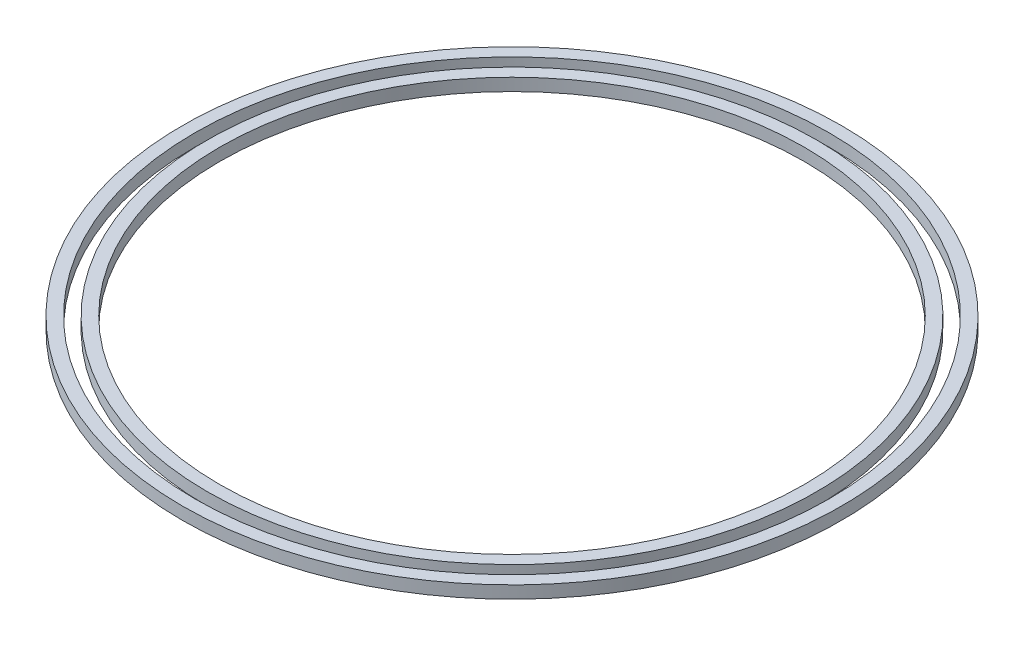
ISO-10303-21;
HEADER;
FILE_DESCRIPTION(('STEP AP214'),'2;1');
FILE_NAME('part.step','',(''),(''),'','','');
FILE_SCHEMA(('AUTOMOTIVE_DESIGN { 1 0 10303 214 1 1 1 1 }'));
ENDSEC;
DATA;
#1=APPLICATION_CONTEXT('core data for automotive mechanical design processes');
#2=APPLICATION_PROTOCOL_DEFINITION('international standard','automotive_design',2000,#1);
#3=PRODUCT_CONTEXT('',#1,'mechanical');
#4=PRODUCT('Part','Part','',(#3));
#5=PRODUCT_RELATED_PRODUCT_CATEGORY('part','',(#4));
#6=PRODUCT_DEFINITION_FORMATION('','',#4);
#7=PRODUCT_DEFINITION_CONTEXT('part definition',#1,'design');
#8=PRODUCT_DEFINITION('design','',#6,#7);
#9=PRODUCT_DEFINITION_SHAPE('','',#8);
#10=(LENGTH_UNIT() NAMED_UNIT(*) SI_UNIT(.MILLI.,.METRE.));
#11=(NAMED_UNIT(*) PLANE_ANGLE_UNIT() SI_UNIT($,.RADIAN.));
#12=(NAMED_UNIT(*) SI_UNIT($,.STERADIAN.) SOLID_ANGLE_UNIT());
#13=UNCERTAINTY_MEASURE_WITH_UNIT(LENGTH_MEASURE(1.E-05),#10,'distance_accuracy_value','');
#14=(GEOMETRIC_REPRESENTATION_CONTEXT(3) GLOBAL_UNCERTAINTY_ASSIGNED_CONTEXT((#13)) GLOBAL_UNIT_ASSIGNED_CONTEXT((#10,
#11,#12)) REPRESENTATION_CONTEXT('',''));
#15=CARTESIAN_POINT('',(0.,0.,0.));
#16=DIRECTION('',(0.,0.,1.));
#17=DIRECTION('',(1.,0.,0.));
#18=AXIS2_PLACEMENT_3D('',#15,#16,#17);
#19=CARTESIAN_POINT('',(0.,7029.64645562816,0.));
#20=DIRECTION('',(0.,-1.,0.));
#21=DIRECTION('',(0.,0.,-1.));
#22=AXIS2_PLACEMENT_3D('',#19,#20,#21);
#23=CYLINDRICAL_SURFACE('',#22,2450.);
#24=CARTESIAN_POINT('',(0.,0.,0.));
#25=DIRECTION('',(0.,-1.,0.));
#26=DIRECTION('',(0.,0.,-1.));
#27=AXIS2_PLACEMENT_3D('',#24,#25,#26);
#28=CIRCLE('',#27,2450.);
#29=CARTESIAN_POINT('',(0.,0.,-2450.));
#30=VERTEX_POINT('',#29);
#31=EDGE_CURVE('E60',#30,#30,#28,.T.);
#32=ORIENTED_EDGE('',*,*,#31,.F.);
#33=EDGE_LOOP('',(#32));
#34=FACE_BOUND('',#33,.T.);
#35=CARTESIAN_POINT('',(0.,99.9999999999996,0.));
#36=DIRECTION('',(0.,1.,0.));
#37=DIRECTION('',(0.,0.,1.));
#38=AXIS2_PLACEMENT_3D('',#35,#36,#37);
#39=CIRCLE('',#38,2450.);
#40=CARTESIAN_POINT('',(0.,99.9999999999996,2450.));
#41=VERTEX_POINT('',#40);
#42=EDGE_CURVE('E69',#41,#41,#39,.F.);
#43=ORIENTED_EDGE('',*,*,#42,.T.);
#44=EDGE_LOOP('',(#43));
#45=FACE_BOUND('',#44,.T.);
#46=ADVANCED_FACE('F53',(#34,#45),#23,.T.);
#47=CARTESIAN_POINT('',(0.,7029.64645562816,0.));
#48=DIRECTION('',(0.,-1.,0.));
#49=DIRECTION('',(0.,0.,-1.));
#50=AXIS2_PLACEMENT_3D('',#47,#48,#49);
#51=CYLINDRICAL_SURFACE('',#50,2350.);
#52=CARTESIAN_POINT('',(0.,0.,0.));
#53=DIRECTION('',(0.,-1.,0.));
#54=DIRECTION('',(0.,0.,-1.));
#55=AXIS2_PLACEMENT_3D('',#52,#53,#54);
#56=CIRCLE('',#55,2350.);
#57=CARTESIAN_POINT('',(0.,0.,-2350.));
#58=VERTEX_POINT('',#57);
#59=EDGE_CURVE('E64',#58,#58,#56,.T.);
#60=ORIENTED_EDGE('',*,*,#59,.T.);
#61=EDGE_LOOP('',(#60));
#62=FACE_BOUND('',#61,.T.);
#63=CARTESIAN_POINT('',(0.,99.9999999999996,0.));
#64=DIRECTION('',(0.,1.,0.));
#65=DIRECTION('',(0.,0.,1.));
#66=AXIS2_PLACEMENT_3D('',#63,#64,#65);
#67=CIRCLE('',#66,2350.);
#68=CARTESIAN_POINT('',(0.,99.9999999999996,2350.));
#69=VERTEX_POINT('',#68);
#70=EDGE_CURVE('E11',#69,#69,#67,.F.);
#71=ORIENTED_EDGE('',*,*,#70,.F.);
#72=EDGE_LOOP('',(#71));
#73=FACE_BOUND('',#72,.T.);
#74=ADVANCED_FACE('F80',(#62,#73),#51,.F.);
#75=CARTESIAN_POINT('',(0.,0.,0.));
#76=DIRECTION('',(0.,-1.,0.));
#77=DIRECTION('',(0.,0.,-1.));
#78=AXIS2_PLACEMENT_3D('',#75,#76,#77);
#79=PLANE('',#78);
#80=ORIENTED_EDGE('',*,*,#59,.F.);
#81=EDGE_LOOP('',(#80));
#82=FACE_BOUND('',#81,.T.);
#83=ORIENTED_EDGE('',*,*,#31,.T.);
#84=EDGE_LOOP('',(#83));
#85=FACE_BOUND('',#84,.T.);
#86=ADVANCED_FACE('F76',(#82,#85),#79,.T.);
#87=CARTESIAN_POINT('',(0.,100.,0.));
#88=DIRECTION('',(0.,1.,0.));
#89=DIRECTION('',(0.,0.,1.));
#90=AXIS2_PLACEMENT_3D('',#87,#88,#89);
#91=PLANE('',#90);
#92=ORIENTED_EDGE('',*,*,#42,.F.);
#93=EDGE_LOOP('',(#92));
#94=FACE_BOUND('',#93,.T.);
#95=ORIENTED_EDGE('',*,*,#70,.T.);
#96=EDGE_LOOP('',(#95));
#97=FACE_BOUND('',#96,.T.);
#98=ADVANCED_FACE('F55',(#94,#97),#91,.T.);
#99=CLOSED_SHELL('',(#46,#74,#86,#98));
#100=MANIFOLD_SOLID_BREP('B2',#99);
#101=CARTESIAN_POINT('',(0.,100.,0.));
#102=DIRECTION('',(0.,1.,0.));
#103=DIRECTION('',(0.,0.,1.));
#104=AXIS2_PLACEMENT_3D('',#101,#102,#103);
#105=PLANE('',#104);
#106=CARTESIAN_POINT('',(0.,100.,0.));
#107=DIRECTION('',(0.,1.,0.));
#108=DIRECTION('',(0.,0.,1.));
#109=AXIS2_PLACEMENT_3D('',#106,#107,#108);
#110=CIRCLE('',#109,2650.);
#111=CARTESIAN_POINT('',(0.,100.,2650.));
#112=VERTEX_POINT('',#111);
#113=EDGE_CURVE('E52',#112,#112,#110,.T.);
#114=ORIENTED_EDGE('',*,*,#113,.T.);
#115=EDGE_LOOP('',(#114));
#116=FACE_BOUND('',#115,.T.);
#117=CARTESIAN_POINT('',(0.,100.,0.));
#118=DIRECTION('',(0.,1.,0.));
#119=DIRECTION('',(0.,0.,1.));
#120=AXIS2_PLACEMENT_3D('',#117,#118,#119);
#121=CIRCLE('',#120,2550.);
#122=CARTESIAN_POINT('',(0.,100.,2550.));
#123=VERTEX_POINT('',#122);
#124=EDGE_CURVE('E128',#123,#123,#121,.T.);
#125=ORIENTED_EDGE('',*,*,#124,.F.);
#126=EDGE_LOOP('',(#125));
#127=FACE_BOUND('',#126,.T.);
#128=ADVANCED_FACE('F115',(#116,#127),#105,.T.);
#129=CARTESIAN_POINT('',(0.,0.,0.));
#130=DIRECTION('',(0.,1.,0.));
#131=DIRECTION('',(0.,0.,1.));
#132=AXIS2_PLACEMENT_3D('',#129,#130,#131);
#133=PLANE('',#132);
#134=CARTESIAN_POINT('',(0.,0.,0.));
#135=DIRECTION('',(0.,1.,0.));
#136=DIRECTION('',(0.,0.,1.));
#137=AXIS2_PLACEMENT_3D('',#134,#135,#136);
#138=CIRCLE('',#137,2650.);
#139=CARTESIAN_POINT('',(0.,0.,2650.));
#140=VERTEX_POINT('',#139);
#141=EDGE_CURVE('E119',#140,#140,#138,.T.);
#142=ORIENTED_EDGE('',*,*,#141,.F.);
#143=EDGE_LOOP('',(#142));
#144=FACE_BOUND('',#143,.T.);
#145=CARTESIAN_POINT('',(0.,0.,0.));
#146=DIRECTION('',(0.,1.,0.));
#147=DIRECTION('',(0.,0.,1.));
#148=AXIS2_PLACEMENT_3D('',#145,#146,#147);
#149=CIRCLE('',#148,2550.);
#150=CARTESIAN_POINT('',(0.,0.,2550.));
#151=VERTEX_POINT('',#150);
#152=EDGE_CURVE('E130',#151,#151,#149,.T.);
#153=ORIENTED_EDGE('',*,*,#152,.T.);
#154=EDGE_LOOP('',(#153));
#155=FACE_BOUND('',#154,.T.);
#156=ADVANCED_FACE('F142',(#144,#155),#133,.F.);
#157=CARTESIAN_POINT('',(0.,100.,0.));
#158=DIRECTION('',(0.,-1.,0.));
#159=DIRECTION('',(0.,0.,-1.));
#160=AXIS2_PLACEMENT_3D('',#157,#158,#159);
#161=CYLINDRICAL_SURFACE('',#160,2650.);
#162=ORIENTED_EDGE('',*,*,#113,.F.);
#163=EDGE_LOOP('',(#162));
#164=FACE_BOUND('',#163,.T.);
#165=ORIENTED_EDGE('',*,*,#141,.T.);
#166=EDGE_LOOP('',(#165));
#167=FACE_BOUND('',#166,.T.);
#168=ADVANCED_FACE('F117',(#164,#167),#161,.T.);
#169=CARTESIAN_POINT('',(0.,100.,0.));
#170=DIRECTION('',(0.,-1.,0.));
#171=DIRECTION('',(0.,0.,-1.));
#172=AXIS2_PLACEMENT_3D('',#169,#170,#171);
#173=CYLINDRICAL_SURFACE('',#172,2550.);
#174=ORIENTED_EDGE('',*,*,#124,.T.);
#175=EDGE_LOOP('',(#174));
#176=FACE_BOUND('',#175,.T.);
#177=ORIENTED_EDGE('',*,*,#152,.F.);
#178=EDGE_LOOP('',(#177));
#179=FACE_BOUND('',#178,.T.);
#180=ADVANCED_FACE('F138',(#176,#179),#173,.F.);
#181=CLOSED_SHELL('',(#128,#156,#168,#180));
#182=MANIFOLD_SOLID_BREP('B6',#181);
#183=ADVANCED_BREP_SHAPE_REPRESENTATION('',(#18,#100,#182),#14);
#184=SHAPE_DEFINITION_REPRESENTATION(#9,#183);
ENDSEC;
END-ISO-10303-21;
